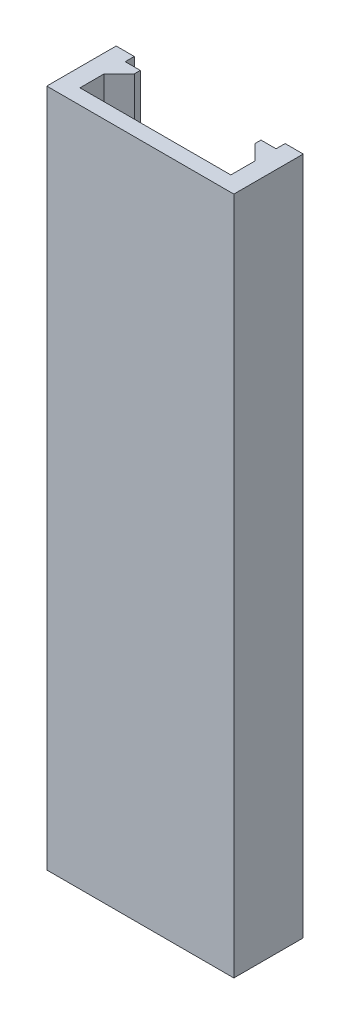
ISO-10303-21;
HEADER;
FILE_DESCRIPTION(('STEP AP214'),'2;1');
FILE_NAME('part.step','',(''),(''),'','','');
FILE_SCHEMA(('AUTOMOTIVE_DESIGN { 1 0 10303 214 1 1 1 1 }'));
ENDSEC;
DATA;
#1=APPLICATION_CONTEXT('core data for automotive mechanical design processes');
#2=APPLICATION_PROTOCOL_DEFINITION('international standard','automotive_design',2000,#1);
#3=PRODUCT_CONTEXT('',#1,'mechanical');
#4=PRODUCT('Part','Part','',(#3));
#5=PRODUCT_RELATED_PRODUCT_CATEGORY('part','',(#4));
#6=PRODUCT_DEFINITION_FORMATION('','',#4);
#7=PRODUCT_DEFINITION_CONTEXT('part definition',#1,'design');
#8=PRODUCT_DEFINITION('design','',#6,#7);
#9=PRODUCT_DEFINITION_SHAPE('','',#8);
#10=(LENGTH_UNIT() NAMED_UNIT(*) SI_UNIT(.MILLI.,.METRE.));
#11=(NAMED_UNIT(*) PLANE_ANGLE_UNIT() SI_UNIT($,.RADIAN.));
#12=(NAMED_UNIT(*) SI_UNIT($,.STERADIAN.) SOLID_ANGLE_UNIT());
#13=UNCERTAINTY_MEASURE_WITH_UNIT(LENGTH_MEASURE(1.E-05),#10,'distance_accuracy_value','');
#14=(GEOMETRIC_REPRESENTATION_CONTEXT(3) GLOBAL_UNCERTAINTY_ASSIGNED_CONTEXT((#13)) GLOBAL_UNIT_ASSIGNED_CONTEXT((#10,
#11,#12)) REPRESENTATION_CONTEXT('',''));
#15=CARTESIAN_POINT('',(0.,0.,0.));
#16=DIRECTION('',(0.,0.,1.));
#17=DIRECTION('',(1.,0.,0.));
#18=AXIS2_PLACEMENT_3D('',#15,#16,#17);
#19=CARTESIAN_POINT('',(-5.,45.,0.));
#20=DIRECTION('',(-1.,0.,0.));
#21=DIRECTION('',(0.,0.,1.));
#22=AXIS2_PLACEMENT_3D('',#19,#20,#21);
#23=PLANE('',#22);
#24=DIRECTION('',(0.,0.,-1.));
#25=VECTOR('',#24,1.);
#26=CARTESIAN_POINT('',(-5.,0.,0.));
#27=LINE('',#26,#25);
#28=CARTESIAN_POINT('',(-5.,0.,0.));
#29=VERTEX_POINT('',#28);
#30=CARTESIAN_POINT('',(-5.,0.,-1.6));
#31=VERTEX_POINT('',#30);
#32=EDGE_CURVE('E181',#29,#31,#27,.T.);
#33=ORIENTED_EDGE('',*,*,#32,.T.);
#34=DIRECTION('',(0.,-1.,0.));
#35=VECTOR('',#34,1.);
#36=CARTESIAN_POINT('',(-5.,45.,-1.6));
#37=LINE('',#36,#35);
#38=CARTESIAN_POINT('',(-5.,45.,-1.6));
#39=VERTEX_POINT('',#38);
#40=EDGE_CURVE('E11',#39,#31,#37,.T.);
#41=ORIENTED_EDGE('',*,*,#40,.F.);
#42=DIRECTION('',(0.,0.,-1.));
#43=VECTOR('',#42,1.);
#44=CARTESIAN_POINT('',(-5.,45.,0.));
#45=LINE('',#44,#43);
#46=CARTESIAN_POINT('',(-5.,45.,0.));
#47=VERTEX_POINT('',#46);
#48=EDGE_CURVE('E211',#47,#39,#45,.T.);
#49=ORIENTED_EDGE('',*,*,#48,.F.);
#50=DIRECTION('',(0.,-1.,0.));
#51=VECTOR('',#50,1.);
#52=CARTESIAN_POINT('',(-5.,45.,0.));
#53=LINE('',#52,#51);
#54=EDGE_CURVE('E177',#47,#29,#53,.T.);
#55=ORIENTED_EDGE('',*,*,#54,.T.);
#56=EDGE_LOOP('',(#33,#41,#49,#55));
#57=FACE_BOUND('',#56,.T.);
#58=ADVANCED_FACE('F37',(#57),#23,.F.);
#59=CARTESIAN_POINT('',(-5.,45.,-1.6));
#60=DIRECTION('',(-0.707106781186547,0.,-0.707106781186547));
#61=DIRECTION('',(-0.707106781186548,0.,0.707106781186547));
#62=AXIS2_PLACEMENT_3D('',#59,#60,#61);
#63=PLANE('',#62);
#64=DIRECTION('',(0.707106781186548,0.,-0.707106781186548));
#65=VECTOR('',#64,1.);
#66=CARTESIAN_POINT('',(-5.,0.,-1.6));
#67=LINE('',#66,#65);
#68=CARTESIAN_POINT('',(-4.,0.,-2.6));
#69=VERTEX_POINT('',#68);
#70=EDGE_CURVE('E184',#31,#69,#67,.T.);
#71=ORIENTED_EDGE('',*,*,#70,.T.);
#72=DIRECTION('',(0.,-1.,0.));
#73=VECTOR('',#72,1.);
#74=CARTESIAN_POINT('',(-4.,45.,-2.6));
#75=LINE('',#74,#73);
#76=CARTESIAN_POINT('',(-4.,45.,-2.6));
#77=VERTEX_POINT('',#76);
#78=EDGE_CURVE('E45',#77,#69,#75,.T.);
#79=ORIENTED_EDGE('',*,*,#78,.F.);
#80=DIRECTION('',(0.707106781186548,0.,-0.707106781186548));
#81=VECTOR('',#80,1.);
#82=CARTESIAN_POINT('',(-5.,45.,-1.6));
#83=LINE('',#82,#81);
#84=EDGE_CURVE('E120',#39,#77,#83,.T.);
#85=ORIENTED_EDGE('',*,*,#84,.F.);
#86=ORIENTED_EDGE('',*,*,#40,.T.);
#87=EDGE_LOOP('',(#71,#79,#85,#86));
#88=FACE_BOUND('',#87,.T.);
#89=ADVANCED_FACE('F309',(#88),#63,.F.);
#90=CARTESIAN_POINT('',(-4.,45.,-2.6));
#91=DIRECTION('',(-1.,0.,0.));
#92=DIRECTION('',(0.,0.,1.));
#93=AXIS2_PLACEMENT_3D('',#90,#91,#92);
#94=PLANE('',#93);
#95=DIRECTION('',(0.,0.,-1.));
#96=VECTOR('',#95,1.);
#97=CARTESIAN_POINT('',(-4.,0.,-2.6));
#98=LINE('',#97,#96);
#99=CARTESIAN_POINT('',(-4.,0.,-3.));
#100=VERTEX_POINT('',#99);
#101=EDGE_CURVE('E186',#69,#100,#98,.T.);
#102=ORIENTED_EDGE('',*,*,#101,.T.);
#103=DIRECTION('',(0.,-1.,0.));
#104=VECTOR('',#103,1.);
#105=CARTESIAN_POINT('',(-4.,45.,-3.));
#106=LINE('',#105,#104);
#107=CARTESIAN_POINT('',(-4.,45.,-3.));
#108=VERTEX_POINT('',#107);
#109=EDGE_CURVE('E242',#108,#100,#106,.T.);
#110=ORIENTED_EDGE('',*,*,#109,.F.);
#111=DIRECTION('',(0.,0.,-1.));
#112=VECTOR('',#111,1.);
#113=CARTESIAN_POINT('',(-4.,45.,-2.6));
#114=LINE('',#113,#112);
#115=EDGE_CURVE('E250',#77,#108,#114,.T.);
#116=ORIENTED_EDGE('',*,*,#115,.F.);
#117=ORIENTED_EDGE('',*,*,#78,.T.);
#118=EDGE_LOOP('',(#102,#110,#116,#117));
#119=FACE_BOUND('',#118,.T.);
#120=ADVANCED_FACE('F248',(#119),#94,.F.);
#121=CARTESIAN_POINT('',(-4.,45.,-3.));
#122=DIRECTION('',(0.,0.,1.));
#123=DIRECTION('',(1.,0.,0.));
#124=AXIS2_PLACEMENT_3D('',#121,#122,#123);
#125=PLANE('',#124);
#126=DIRECTION('',(-1.,0.,0.));
#127=VECTOR('',#126,1.);
#128=CARTESIAN_POINT('',(-4.,0.,-3.));
#129=LINE('',#128,#127);
#130=CARTESIAN_POINT('',(-5.,0.,-3.));
#131=VERTEX_POINT('',#130);
#132=EDGE_CURVE('E188',#100,#131,#129,.T.);
#133=ORIENTED_EDGE('',*,*,#132,.T.);
#134=DIRECTION('',(0.,-1.,0.));
#135=VECTOR('',#134,1.);
#136=CARTESIAN_POINT('',(-5.,45.,-3.));
#137=LINE('',#136,#135);
#138=CARTESIAN_POINT('',(-5.,45.,-3.));
#139=VERTEX_POINT('',#138);
#140=EDGE_CURVE('E239',#139,#131,#137,.T.);
#141=ORIENTED_EDGE('',*,*,#140,.F.);
#142=DIRECTION('',(-1.,0.,0.));
#143=VECTOR('',#142,1.);
#144=CARTESIAN_POINT('',(-4.,45.,-3.));
#145=LINE('',#144,#143);
#146=EDGE_CURVE('E268',#108,#139,#145,.T.);
#147=ORIENTED_EDGE('',*,*,#146,.F.);
#148=ORIENTED_EDGE('',*,*,#109,.T.);
#149=EDGE_LOOP('',(#133,#141,#147,#148));
#150=FACE_BOUND('',#149,.T.);
#151=ADVANCED_FACE('F259',(#150),#125,.F.);
#152=CARTESIAN_POINT('',(-5.,45.,-3.));
#153=DIRECTION('',(-1.,0.,0.));
#154=DIRECTION('',(0.,0.,1.));
#155=AXIS2_PLACEMENT_3D('',#152,#153,#154);
#156=PLANE('',#155);
#157=DIRECTION('',(0.,0.,-1.));
#158=VECTOR('',#157,1.);
#159=CARTESIAN_POINT('',(-5.,0.,-3.));
#160=LINE('',#159,#158);
#161=CARTESIAN_POINT('',(-5.,0.,-3.6));
#162=VERTEX_POINT('',#161);
#163=EDGE_CURVE('E190',#131,#162,#160,.T.);
#164=ORIENTED_EDGE('',*,*,#163,.T.);
#165=DIRECTION('',(0.,-1.,0.));
#166=VECTOR('',#165,1.);
#167=CARTESIAN_POINT('',(-5.,45.,-3.6));
#168=LINE('',#167,#166);
#169=CARTESIAN_POINT('',(-5.,45.,-3.6));
#170=VERTEX_POINT('',#169);
#171=EDGE_CURVE('E236',#170,#162,#168,.T.);
#172=ORIENTED_EDGE('',*,*,#171,.F.);
#173=DIRECTION('',(0.,0.,-1.));
#174=VECTOR('',#173,1.);
#175=CARTESIAN_POINT('',(-5.,45.,-3.));
#176=LINE('',#175,#174);
#177=EDGE_CURVE('E265',#139,#170,#176,.T.);
#178=ORIENTED_EDGE('',*,*,#177,.F.);
#179=ORIENTED_EDGE('',*,*,#140,.T.);
#180=EDGE_LOOP('',(#164,#172,#178,#179));
#181=FACE_BOUND('',#180,.T.);
#182=ADVANCED_FACE('F263',(#181),#156,.F.);
#183=CARTESIAN_POINT('',(-5.,45.,-3.6));
#184=DIRECTION('',(0.,0.,1.));
#185=DIRECTION('',(1.,0.,0.));
#186=AXIS2_PLACEMENT_3D('',#183,#184,#185);
#187=PLANE('',#186);
#188=DIRECTION('',(-1.,0.,0.));
#189=VECTOR('',#188,1.);
#190=CARTESIAN_POINT('',(-5.,0.,-3.6));
#191=LINE('',#190,#189);
#192=CARTESIAN_POINT('',(-6.2,0.,-3.6));
#193=VERTEX_POINT('',#192);
#194=EDGE_CURVE('E192',#162,#193,#191,.T.);
#195=ORIENTED_EDGE('',*,*,#194,.T.);
#196=DIRECTION('',(0.,-1.,0.));
#197=VECTOR('',#196,1.);
#198=CARTESIAN_POINT('',(-6.2,45.,-3.6));
#199=LINE('',#198,#197);
#200=CARTESIAN_POINT('',(-6.2,45.,-3.6));
#201=VERTEX_POINT('',#200);
#202=EDGE_CURVE('E233',#201,#193,#199,.T.);
#203=ORIENTED_EDGE('',*,*,#202,.F.);
#204=DIRECTION('',(-1.,0.,0.));
#205=VECTOR('',#204,1.);
#206=CARTESIAN_POINT('',(-5.,45.,-3.6));
#207=LINE('',#206,#205);
#208=EDGE_CURVE('E267',#170,#201,#207,.T.);
#209=ORIENTED_EDGE('',*,*,#208,.F.);
#210=ORIENTED_EDGE('',*,*,#171,.T.);
#211=EDGE_LOOP('',(#195,#203,#209,#210));
#212=FACE_BOUND('',#211,.T.);
#213=ADVANCED_FACE('F322',(#212),#187,.F.);
#214=CARTESIAN_POINT('',(-6.2,45.,-3.6));
#215=DIRECTION('',(1.,0.,0.));
#216=DIRECTION('',(0.,0.,-1.));
#217=AXIS2_PLACEMENT_3D('',#214,#215,#216);
#218=PLANE('',#217);
#219=DIRECTION('',(0.,0.,1.));
#220=VECTOR('',#219,1.);
#221=CARTESIAN_POINT('',(-6.2,0.,-3.6));
#222=LINE('',#221,#220);
#223=CARTESIAN_POINT('',(-6.2,0.,1.));
#224=VERTEX_POINT('',#223);
#225=EDGE_CURVE('E194',#193,#224,#222,.T.);
#226=ORIENTED_EDGE('',*,*,#225,.T.);
#227=DIRECTION('',(0.,-1.,0.));
#228=VECTOR('',#227,1.);
#229=CARTESIAN_POINT('',(-6.2,45.,1.));
#230=LINE('',#229,#228);
#231=CARTESIAN_POINT('',(-6.2,45.,1.));
#232=VERTEX_POINT('',#231);
#233=EDGE_CURVE('E230',#232,#224,#230,.T.);
#234=ORIENTED_EDGE('',*,*,#233,.F.);
#235=DIRECTION('',(0.,0.,1.));
#236=VECTOR('',#235,1.);
#237=CARTESIAN_POINT('',(-6.2,45.,-3.6));
#238=LINE('',#237,#236);
#239=EDGE_CURVE('E270',#201,#232,#238,.T.);
#240=ORIENTED_EDGE('',*,*,#239,.F.);
#241=ORIENTED_EDGE('',*,*,#202,.T.);
#242=EDGE_LOOP('',(#226,#234,#240,#241));
#243=FACE_BOUND('',#242,.T.);
#244=ADVANCED_FACE('F325',(#243),#218,.F.);
#245=CARTESIAN_POINT('',(-6.2,45.,1.));
#246=DIRECTION('',(0.,0.,-1.));
#247=DIRECTION('',(-1.,0.,0.));
#248=AXIS2_PLACEMENT_3D('',#245,#246,#247);
#249=PLANE('',#248);
#250=DIRECTION('',(1.,0.,0.));
#251=VECTOR('',#250,1.);
#252=CARTESIAN_POINT('',(-6.2,0.,1.));
#253=LINE('',#252,#251);
#254=CARTESIAN_POINT('',(6.20000000000001,0.,1.));
#255=VERTEX_POINT('',#254);
#256=EDGE_CURVE('E196',#224,#255,#253,.T.);
#257=ORIENTED_EDGE('',*,*,#256,.T.);
#258=DIRECTION('',(0.,-1.,0.));
#259=VECTOR('',#258,1.);
#260=CARTESIAN_POINT('',(6.20000000000001,45.,1.));
#261=LINE('',#260,#259);
#262=CARTESIAN_POINT('',(6.20000000000001,45.,1.));
#263=VERTEX_POINT('',#262);
#264=EDGE_CURVE('E227',#263,#255,#261,.T.);
#265=ORIENTED_EDGE('',*,*,#264,.F.);
#266=DIRECTION('',(1.,0.,0.));
#267=VECTOR('',#266,1.);
#268=CARTESIAN_POINT('',(-6.2,45.,1.));
#269=LINE('',#268,#267);
#270=EDGE_CURVE('E276',#232,#263,#269,.T.);
#271=ORIENTED_EDGE('',*,*,#270,.F.);
#272=ORIENTED_EDGE('',*,*,#233,.T.);
#273=EDGE_LOOP('',(#257,#265,#271,#272));
#274=FACE_BOUND('',#273,.T.);
#275=ADVANCED_FACE('F329',(#274),#249,.F.);
#276=CARTESIAN_POINT('',(6.2,45.,-3.6));
#277=DIRECTION('',(-1.,0.,0.));
#278=DIRECTION('',(0.,0.,1.));
#279=AXIS2_PLACEMENT_3D('',#276,#277,#278);
#280=PLANE('',#279);
#281=DIRECTION('',(0.,0.,-1.));
#282=VECTOR('',#281,1.);
#283=CARTESIAN_POINT('',(6.2,0.,-3.6));
#284=LINE('',#283,#282);
#285=CARTESIAN_POINT('',(6.2,0.,-3.6));
#286=VERTEX_POINT('',#285);
#287=EDGE_CURVE('E198',#255,#286,#284,.T.);
#288=ORIENTED_EDGE('',*,*,#287,.T.);
#289=DIRECTION('',(0.,-1.,0.));
#290=VECTOR('',#289,1.);
#291=CARTESIAN_POINT('',(6.2,45.,-3.6));
#292=LINE('',#291,#290);
#293=CARTESIAN_POINT('',(6.2,45.,-3.6));
#294=VERTEX_POINT('',#293);
#295=EDGE_CURVE('E224',#294,#286,#292,.T.);
#296=ORIENTED_EDGE('',*,*,#295,.F.);
#297=DIRECTION('',(0.,0.,-1.));
#298=VECTOR('',#297,1.);
#299=CARTESIAN_POINT('',(6.2,45.,-3.6));
#300=LINE('',#299,#298);
#301=EDGE_CURVE('E278',#263,#294,#300,.T.);
#302=ORIENTED_EDGE('',*,*,#301,.F.);
#303=ORIENTED_EDGE('',*,*,#264,.T.);
#304=EDGE_LOOP('',(#288,#296,#302,#303));
#305=FACE_BOUND('',#304,.T.);
#306=ADVANCED_FACE('F333',(#305),#280,.F.);
#307=CARTESIAN_POINT('',(5.,45.,-3.6));
#308=DIRECTION('',(0.,0.,1.));
#309=DIRECTION('',(1.,0.,0.));
#310=AXIS2_PLACEMENT_3D('',#307,#308,#309);
#311=PLANE('',#310);
#312=DIRECTION('',(-1.,0.,0.));
#313=VECTOR('',#312,1.);
#314=CARTESIAN_POINT('',(5.,0.,-3.6));
#315=LINE('',#314,#313);
#316=CARTESIAN_POINT('',(5.,0.,-3.6));
#317=VERTEX_POINT('',#316);
#318=EDGE_CURVE('E200',#286,#317,#315,.T.);
#319=ORIENTED_EDGE('',*,*,#318,.T.);
#320=DIRECTION('',(0.,-1.,0.));
#321=VECTOR('',#320,1.);
#322=CARTESIAN_POINT('',(5.,45.,-3.6));
#323=LINE('',#322,#321);
#324=CARTESIAN_POINT('',(5.,45.,-3.6));
#325=VERTEX_POINT('',#324);
#326=EDGE_CURVE('E221',#325,#317,#323,.T.);
#327=ORIENTED_EDGE('',*,*,#326,.F.);
#328=DIRECTION('',(-1.,0.,0.));
#329=VECTOR('',#328,1.);
#330=CARTESIAN_POINT('',(5.,45.,-3.6));
#331=LINE('',#330,#329);
#332=EDGE_CURVE('E280',#294,#325,#331,.T.);
#333=ORIENTED_EDGE('',*,*,#332,.F.);
#334=ORIENTED_EDGE('',*,*,#295,.T.);
#335=EDGE_LOOP('',(#319,#327,#333,#334));
#336=FACE_BOUND('',#335,.T.);
#337=ADVANCED_FACE('F337',(#336),#311,.F.);
#338=CARTESIAN_POINT('',(5.,45.,-3.));
#339=DIRECTION('',(1.,0.,0.));
#340=DIRECTION('',(0.,0.,-1.));
#341=AXIS2_PLACEMENT_3D('',#338,#339,#340);
#342=PLANE('',#341);
#343=DIRECTION('',(0.,0.,1.));
#344=VECTOR('',#343,1.);
#345=CARTESIAN_POINT('',(5.,0.,-3.));
#346=LINE('',#345,#344);
#347=CARTESIAN_POINT('',(5.,0.,-3.));
#348=VERTEX_POINT('',#347);
#349=EDGE_CURVE('E202',#317,#348,#346,.T.);
#350=ORIENTED_EDGE('',*,*,#349,.T.);
#351=DIRECTION('',(0.,-1.,0.));
#352=VECTOR('',#351,1.);
#353=CARTESIAN_POINT('',(5.,45.,-3.));
#354=LINE('',#353,#352);
#355=CARTESIAN_POINT('',(5.,45.,-3.));
#356=VERTEX_POINT('',#355);
#357=EDGE_CURVE('E218',#356,#348,#354,.T.);
#358=ORIENTED_EDGE('',*,*,#357,.F.);
#359=DIRECTION('',(0.,0.,1.));
#360=VECTOR('',#359,1.);
#361=CARTESIAN_POINT('',(5.,45.,-3.));
#362=LINE('',#361,#360);
#363=EDGE_CURVE('E282',#325,#356,#362,.T.);
#364=ORIENTED_EDGE('',*,*,#363,.F.);
#365=ORIENTED_EDGE('',*,*,#326,.T.);
#366=EDGE_LOOP('',(#350,#358,#364,#365));
#367=FACE_BOUND('',#366,.T.);
#368=ADVANCED_FACE('F341',(#367),#342,.F.);
#369=CARTESIAN_POINT('',(4.,45.,-3.));
#370=DIRECTION('',(0.,0.,1.));
#371=DIRECTION('',(1.,0.,0.));
#372=AXIS2_PLACEMENT_3D('',#369,#370,#371);
#373=PLANE('',#372);
#374=DIRECTION('',(-1.,0.,0.));
#375=VECTOR('',#374,1.);
#376=CARTESIAN_POINT('',(4.,0.,-3.));
#377=LINE('',#376,#375);
#378=CARTESIAN_POINT('',(4.,0.,-3.));
#379=VERTEX_POINT('',#378);
#380=EDGE_CURVE('E204',#348,#379,#377,.T.);
#381=ORIENTED_EDGE('',*,*,#380,.T.);
#382=DIRECTION('',(0.,-1.,0.));
#383=VECTOR('',#382,1.);
#384=CARTESIAN_POINT('',(4.,45.,-3.));
#385=LINE('',#384,#383);
#386=CARTESIAN_POINT('',(4.,45.,-3.));
#387=VERTEX_POINT('',#386);
#388=EDGE_CURVE('E215',#387,#379,#385,.T.);
#389=ORIENTED_EDGE('',*,*,#388,.F.);
#390=DIRECTION('',(-1.,0.,0.));
#391=VECTOR('',#390,1.);
#392=CARTESIAN_POINT('',(4.,45.,-3.));
#393=LINE('',#392,#391);
#394=EDGE_CURVE('E284',#356,#387,#393,.T.);
#395=ORIENTED_EDGE('',*,*,#394,.F.);
#396=ORIENTED_EDGE('',*,*,#357,.T.);
#397=EDGE_LOOP('',(#381,#389,#395,#396));
#398=FACE_BOUND('',#397,.T.);
#399=ADVANCED_FACE('F290',(#398),#373,.F.);
#400=CARTESIAN_POINT('',(4.,45.,-2.6));
#401=DIRECTION('',(1.,0.,0.));
#402=DIRECTION('',(0.,0.,-1.));
#403=AXIS2_PLACEMENT_3D('',#400,#401,#402);
#404=PLANE('',#403);
#405=DIRECTION('',(0.,0.,1.));
#406=VECTOR('',#405,1.);
#407=CARTESIAN_POINT('',(4.,0.,-2.6));
#408=LINE('',#407,#406);
#409=CARTESIAN_POINT('',(4.,0.,-2.6));
#410=VERTEX_POINT('',#409);
#411=EDGE_CURVE('E206',#379,#410,#408,.T.);
#412=ORIENTED_EDGE('',*,*,#411,.T.);
#413=DIRECTION('',(0.,-1.,0.));
#414=VECTOR('',#413,1.);
#415=CARTESIAN_POINT('',(4.,45.,-2.6));
#416=LINE('',#415,#414);
#417=CARTESIAN_POINT('',(4.,45.,-2.6));
#418=VERTEX_POINT('',#417);
#419=EDGE_CURVE('E172',#418,#410,#416,.T.);
#420=ORIENTED_EDGE('',*,*,#419,.F.);
#421=DIRECTION('',(0.,0.,1.));
#422=VECTOR('',#421,1.);
#423=CARTESIAN_POINT('',(4.,45.,-2.6));
#424=LINE('',#423,#422);
#425=EDGE_CURVE('E163',#387,#418,#424,.T.);
#426=ORIENTED_EDGE('',*,*,#425,.F.);
#427=ORIENTED_EDGE('',*,*,#388,.T.);
#428=EDGE_LOOP('',(#412,#420,#426,#427));
#429=FACE_BOUND('',#428,.T.);
#430=ADVANCED_FACE('F294',(#429),#404,.F.);
#431=CARTESIAN_POINT('',(5.,45.,-1.6));
#432=DIRECTION('',(0.707106781186547,0.,-0.707106781186547));
#433=DIRECTION('',(-0.707106781186548,0.,-0.707106781186547));
#434=AXIS2_PLACEMENT_3D('',#431,#432,#433);
#435=PLANE('',#434);
#436=DIRECTION('',(0.707106781186548,0.,0.707106781186548));
#437=VECTOR('',#436,1.);
#438=CARTESIAN_POINT('',(5.,0.,-1.6));
#439=LINE('',#438,#437);
#440=CARTESIAN_POINT('',(5.,0.,-1.6));
#441=VERTEX_POINT('',#440);
#442=EDGE_CURVE('E171',#410,#441,#439,.T.);
#443=ORIENTED_EDGE('',*,*,#442,.T.);
#444=DIRECTION('',(0.,-1.,0.));
#445=VECTOR('',#444,1.);
#446=CARTESIAN_POINT('',(5.,45.,-1.6));
#447=LINE('',#446,#445);
#448=CARTESIAN_POINT('',(5.,45.,-1.6));
#449=VERTEX_POINT('',#448);
#450=EDGE_CURVE('E168',#449,#441,#447,.T.);
#451=ORIENTED_EDGE('',*,*,#450,.F.);
#452=DIRECTION('',(0.707106781186548,0.,0.707106781186548));
#453=VECTOR('',#452,1.);
#454=CARTESIAN_POINT('',(5.,45.,-1.6));
#455=LINE('',#454,#453);
#456=EDGE_CURVE('E157',#418,#449,#455,.T.);
#457=ORIENTED_EDGE('',*,*,#456,.F.);
#458=ORIENTED_EDGE('',*,*,#419,.T.);
#459=EDGE_LOOP('',(#443,#451,#457,#458));
#460=FACE_BOUND('',#459,.T.);
#461=ADVANCED_FACE('F169',(#460),#435,.F.);
#462=CARTESIAN_POINT('',(5.,45.,0.));
#463=DIRECTION('',(1.,0.,0.));
#464=DIRECTION('',(0.,0.,-1.));
#465=AXIS2_PLACEMENT_3D('',#462,#463,#464);
#466=PLANE('',#465);
#467=DIRECTION('',(0.,0.,1.));
#468=VECTOR('',#467,1.);
#469=CARTESIAN_POINT('',(5.,0.,0.));
#470=LINE('',#469,#468);
#471=CARTESIAN_POINT('',(5.,0.,0.));
#472=VERTEX_POINT('',#471);
#473=EDGE_CURVE('E106',#441,#472,#470,.T.);
#474=ORIENTED_EDGE('',*,*,#473,.T.);
#475=DIRECTION('',(0.,-1.,0.));
#476=VECTOR('',#475,1.);
#477=CARTESIAN_POINT('',(5.,45.,0.));
#478=LINE('',#477,#476);
#479=CARTESIAN_POINT('',(5.,45.,0.));
#480=VERTEX_POINT('',#479);
#481=EDGE_CURVE('E173',#480,#472,#478,.T.);
#482=ORIENTED_EDGE('',*,*,#481,.F.);
#483=DIRECTION('',(0.,0.,1.));
#484=VECTOR('',#483,1.);
#485=CARTESIAN_POINT('',(5.,45.,0.));
#486=LINE('',#485,#484);
#487=EDGE_CURVE('E161',#449,#480,#486,.T.);
#488=ORIENTED_EDGE('',*,*,#487,.F.);
#489=ORIENTED_EDGE('',*,*,#450,.T.);
#490=EDGE_LOOP('',(#474,#482,#488,#489));
#491=FACE_BOUND('',#490,.T.);
#492=ADVANCED_FACE('F175',(#491),#466,.F.);
#493=CARTESIAN_POINT('',(-5.,45.,0.));
#494=DIRECTION('',(0.,0.,1.));
#495=DIRECTION('',(1.,0.,0.));
#496=AXIS2_PLACEMENT_3D('',#493,#494,#495);
#497=PLANE('',#496);
#498=DIRECTION('',(-1.,0.,0.));
#499=VECTOR('',#498,1.);
#500=CARTESIAN_POINT('',(-5.,0.,0.));
#501=LINE('',#500,#499);
#502=EDGE_CURVE('E112',#472,#29,#501,.T.);
#503=ORIENTED_EDGE('',*,*,#502,.T.);
#504=ORIENTED_EDGE('',*,*,#54,.F.);
#505=DIRECTION('',(-1.,0.,0.));
#506=VECTOR('',#505,1.);
#507=CARTESIAN_POINT('',(-5.,45.,0.));
#508=LINE('',#507,#506);
#509=EDGE_CURVE('E53',#480,#47,#508,.T.);
#510=ORIENTED_EDGE('',*,*,#509,.F.);
#511=ORIENTED_EDGE('',*,*,#481,.T.);
#512=EDGE_LOOP('',(#503,#504,#510,#511));
#513=FACE_BOUND('',#512,.T.);
#514=ADVANCED_FACE('F298',(#513),#497,.F.);
#515=CARTESIAN_POINT('',(0.,45.,0.));
#516=DIRECTION('',(0.,1.,0.));
#517=DIRECTION('',(0.,0.,1.));
#518=AXIS2_PLACEMENT_3D('',#515,#516,#517);
#519=PLANE('',#518);
#520=ORIENTED_EDGE('',*,*,#48,.T.);
#521=ORIENTED_EDGE('',*,*,#84,.T.);
#522=ORIENTED_EDGE('',*,*,#115,.T.);
#523=ORIENTED_EDGE('',*,*,#146,.T.);
#524=ORIENTED_EDGE('',*,*,#177,.T.);
#525=ORIENTED_EDGE('',*,*,#208,.T.);
#526=ORIENTED_EDGE('',*,*,#239,.T.);
#527=ORIENTED_EDGE('',*,*,#270,.T.);
#528=ORIENTED_EDGE('',*,*,#301,.T.);
#529=ORIENTED_EDGE('',*,*,#332,.T.);
#530=ORIENTED_EDGE('',*,*,#363,.T.);
#531=ORIENTED_EDGE('',*,*,#394,.T.);
#532=ORIENTED_EDGE('',*,*,#425,.T.);
#533=ORIENTED_EDGE('',*,*,#456,.T.);
#534=ORIENTED_EDGE('',*,*,#487,.T.);
#535=ORIENTED_EDGE('',*,*,#509,.T.);
#536=EDGE_LOOP('',(#520,#521,#522,#523,#524,#525,#526,#527,#528,#529,#530,#531,#532,#533,#534,#535));
#537=FACE_BOUND('',#536,.T.);
#538=ADVANCED_FACE('F159',(#537),#519,.T.);
#539=CARTESIAN_POINT('',(0.,0.,0.));
#540=DIRECTION('',(0.,1.,0.));
#541=DIRECTION('',(0.,0.,1.));
#542=AXIS2_PLACEMENT_3D('',#539,#540,#541);
#543=PLANE('',#542);
#544=ORIENTED_EDGE('',*,*,#32,.F.);
#545=ORIENTED_EDGE('',*,*,#502,.F.);
#546=ORIENTED_EDGE('',*,*,#473,.F.);
#547=ORIENTED_EDGE('',*,*,#442,.F.);
#548=ORIENTED_EDGE('',*,*,#411,.F.);
#549=ORIENTED_EDGE('',*,*,#380,.F.);
#550=ORIENTED_EDGE('',*,*,#349,.F.);
#551=ORIENTED_EDGE('',*,*,#318,.F.);
#552=ORIENTED_EDGE('',*,*,#287,.F.);
#553=ORIENTED_EDGE('',*,*,#256,.F.);
#554=ORIENTED_EDGE('',*,*,#225,.F.);
#555=ORIENTED_EDGE('',*,*,#194,.F.);
#556=ORIENTED_EDGE('',*,*,#163,.F.);
#557=ORIENTED_EDGE('',*,*,#132,.F.);
#558=ORIENTED_EDGE('',*,*,#101,.F.);
#559=ORIENTED_EDGE('',*,*,#70,.F.);
#560=EDGE_LOOP('',(#544,#545,#546,#547,#548,#549,#550,#551,#552,#553,#554,#555,#556,#557,#558,#559));
#561=FACE_BOUND('',#560,.T.);
#562=ADVANCED_FACE('F254',(#561),#543,.F.);
#563=CLOSED_SHELL('',(#58,#89,#120,#151,#182,#213,#244,#275,#306,#337,#368,#399,#430,#461,#492,
#514,#538,#562));
#564=MANIFOLD_SOLID_BREP('B2',#563);
#565=ADVANCED_BREP_SHAPE_REPRESENTATION('',(#18,#564),#14);
#566=SHAPE_DEFINITION_REPRESENTATION(#9,#565);
ENDSEC;
END-ISO-10303-21;
